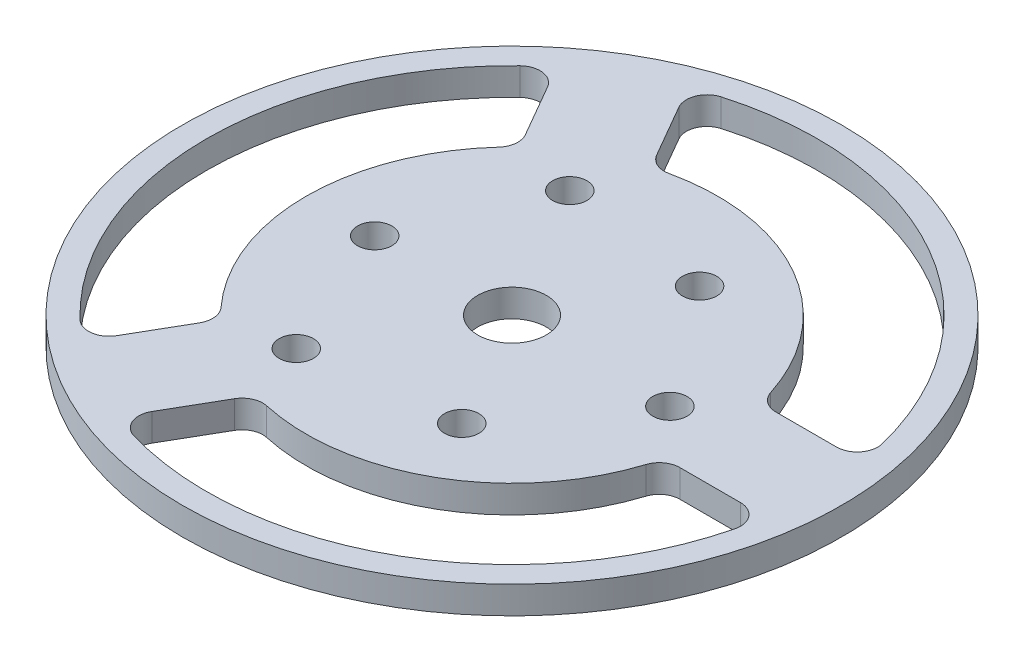
ISO-10303-21;
HEADER;
FILE_DESCRIPTION(('STEP AP214'),'2;1');
FILE_NAME('part.step','',(''),(''),'','','');
FILE_SCHEMA(('AUTOMOTIVE_DESIGN { 1 0 10303 214 1 1 1 1 }'));
ENDSEC;
DATA;
#1=APPLICATION_CONTEXT('core data for automotive mechanical design processes');
#2=APPLICATION_PROTOCOL_DEFINITION('international standard','automotive_design',2000,#1);
#3=PRODUCT_CONTEXT('',#1,'mechanical');
#4=PRODUCT('Part','Part','',(#3));
#5=PRODUCT_RELATED_PRODUCT_CATEGORY('part','',(#4));
#6=PRODUCT_DEFINITION_FORMATION('','',#4);
#7=PRODUCT_DEFINITION_CONTEXT('part definition',#1,'design');
#8=PRODUCT_DEFINITION('design','',#6,#7);
#9=PRODUCT_DEFINITION_SHAPE('','',#8);
#10=(LENGTH_UNIT() NAMED_UNIT(*) SI_UNIT(.MILLI.,.METRE.));
#11=(NAMED_UNIT(*) PLANE_ANGLE_UNIT() SI_UNIT($,.RADIAN.));
#12=(NAMED_UNIT(*) SI_UNIT($,.STERADIAN.) SOLID_ANGLE_UNIT());
#13=UNCERTAINTY_MEASURE_WITH_UNIT(LENGTH_MEASURE(1.E-05),#10,'distance_accuracy_value','');
#14=(GEOMETRIC_REPRESENTATION_CONTEXT(3) GLOBAL_UNCERTAINTY_ASSIGNED_CONTEXT((#13)) GLOBAL_UNIT_ASSIGNED_CONTEXT((#10,
#11,#12)) REPRESENTATION_CONTEXT('',''));
#15=CARTESIAN_POINT('',(0.,0.,0.));
#16=DIRECTION('',(0.,0.,1.));
#17=DIRECTION('',(1.,0.,0.));
#18=AXIS2_PLACEMENT_3D('',#15,#16,#17);
#19=CARTESIAN_POINT('',(0.,3.,0.));
#20=DIRECTION('',(0.,1.,0.));
#21=DIRECTION('',(0.,0.,1.));
#22=AXIS2_PLACEMENT_3D('',#19,#20,#21);
#23=PLANE('',#22);
#24=CARTESIAN_POINT('',(0.,3.,0.));
#25=DIRECTION('',(0.,1.,0.));
#26=DIRECTION('',(0.,0.,1.));
#27=AXIS2_PLACEMENT_3D('',#24,#25,#26);
#28=CIRCLE('',#27,5.);
#29=CARTESIAN_POINT('',(0.,3.,5.00000000000001));
#30=VERTEX_POINT('',#29);
#31=EDGE_CURVE('E365',#30,#30,#28,.T.);
#32=ORIENTED_EDGE('',*,*,#31,.F.);
#33=EDGE_LOOP('',(#32));
#34=FACE_BOUND('',#33,.T.);
#35=CARTESIAN_POINT('',(0.,3.,0.));
#36=DIRECTION('',(0.,1.,0.));
#37=DIRECTION('',(0.,0.,1.));
#38=AXIS2_PLACEMENT_3D('',#35,#36,#37);
#39=CIRCLE('',#38,44.5);
#40=CARTESIAN_POINT('',(43.188767017109,3.,-10.722891566265));
#41=VERTEX_POINT('',#40);
#42=CARTESIAN_POINT('',(-12.3080870101431,3.,-42.7640151780764));
#43=VERTEX_POINT('',#42);
#44=EDGE_CURVE('E390',#41,#43,#39,.T.);
#45=ORIENTED_EDGE('',*,*,#44,.F.);
#46=CARTESIAN_POINT('',(40.2771647462926,3.,-9.99999999999999));
#47=DIRECTION('',(0.,1.,0.));
#48=DIRECTION('',(0.,0.,1.));
#49=AXIS2_PLACEMENT_3D('',#46,#47,#48);
#50=CIRCLE('',#49,3.);
#51=CARTESIAN_POINT('',(40.2771647462926,3.,-6.99999999999999));
#52=VERTEX_POINT('',#51);
#53=EDGE_CURVE('E306',#41,#52,#50,.F.);
#54=ORIENTED_EDGE('',*,*,#53,.T.);
#55=DIRECTION('',(1.,0.,0.));
#56=VECTOR('',#55,1.);
#57=CARTESIAN_POINT('',(43.9459895781173,3.,-6.99999999999999));
#58=LINE('',#57,#56);
#59=CARTESIAN_POINT('',(31.4483703870327,3.,-6.99999999999999));
#60=VERTEX_POINT('',#59);
#61=EDGE_CURVE('E382',#60,#52,#58,.T.);
#62=ORIENTED_EDGE('',*,*,#61,.F.);
#63=CARTESIAN_POINT('',(31.4483703870327,3.,-9.99999999999999));
#64=DIRECTION('',(0.,1.,0.));
#65=DIRECTION('',(0.,0.,1.));
#66=AXIS2_PLACEMENT_3D('',#63,#64,#65);
#67=CIRCLE('',#66,3.);
#68=CARTESIAN_POINT('',(28.5894276245752,3.,-9.09090909090908));
#69=VERTEX_POINT('',#68);
#70=EDGE_CURVE('E318',#60,#69,#67,.F.);
#71=ORIENTED_EDGE('',*,*,#70,.T.);
#72=CARTESIAN_POINT('',(0.,3.,0.));
#73=DIRECTION('',(0.,-1.,0.));
#74=DIRECTION('',(0.,0.,1.));
#75=AXIS2_PLACEMENT_3D('',#72,#73,#74);
#76=CIRCLE('',#75,30.);
#77=CARTESIAN_POINT('',(-6.42175559606551,3.,-29.3046251479933));
#78=VERTEX_POINT('',#77);
#79=EDGE_CURVE('E396',#78,#69,#76,.T.);
#80=ORIENTED_EDGE('',*,*,#79,.F.);
#81=CARTESIAN_POINT('',(-7.06393115567206,3.,-32.2350876627926));
#82=DIRECTION('',(0.,1.,0.));
#83=DIRECTION('',(0.,0.,1.));
#84=AXIS2_PLACEMENT_3D('',#81,#82,#83);
#85=CIRCLE('',#84,3.);
#86=CARTESIAN_POINT('',(-9.66200736702538,3.,-30.7350876627926));
#87=VERTEX_POINT('',#86);
#88=EDGE_CURVE('E314',#78,#87,#85,.F.);
#89=ORIENTED_EDGE('',*,*,#88,.T.);
#90=DIRECTION('',(0.5,0.,0.866025403784438));
#91=VECTOR('',#90,1.);
#92=CARTESIAN_POINT('',(-15.9108169625677,3.,-41.5583433690958));
#93=LINE('',#92,#91);
#94=CARTESIAN_POINT('',(-14.0764045466553,3.,-38.3810478627004));
#95=VERTEX_POINT('',#94);
#96=EDGE_CURVE('E393',#95,#87,#93,.T.);
#97=ORIENTED_EDGE('',*,*,#96,.F.);
#98=CARTESIAN_POINT('',(-11.478328335302,3.,-39.8810478627004));
#99=DIRECTION('',(0.,1.,0.));
#100=DIRECTION('',(0.,0.,1.));
#101=AXIS2_PLACEMENT_3D('',#98,#99,#100);
#102=CIRCLE('',#101,3.);
#103=EDGE_CURVE('E298',#95,#43,#102,.F.);
#104=ORIENTED_EDGE('',*,*,#103,.T.);
#105=EDGE_LOOP('',(#45,#54,#62,#71,#80,#89,#97,#104));
#106=FACE_BOUND('',#105,.T.);
#107=CARTESIAN_POINT('',(0.,3.,0.));
#108=DIRECTION('',(0.,1.,0.));
#109=DIRECTION('',(0.,0.,1.));
#110=AXIS2_PLACEMENT_3D('',#107,#108,#109);
#111=CIRCLE('',#110,44.5);
#112=CARTESIAN_POINT('',(-30.880680006966,3.,-32.0411236118113));
#113=VERTEX_POINT('',#112);
#114=CARTESIAN_POINT('',(-30.880680006966,3.,32.0411236118114));
#115=VERTEX_POINT('',#114);
#116=EDGE_CURVE('E341',#113,#115,#111,.T.);
#117=ORIENTED_EDGE('',*,*,#116,.F.);
#118=CARTESIAN_POINT('',(-28.7988364109908,3.,-29.8810478627005));
#119=DIRECTION('',(0.,1.,0.));
#120=DIRECTION('',(0.,0.,1.));
#121=AXIS2_PLACEMENT_3D('',#118,#119,#120);
#122=CIRCLE('',#121,3.);
#123=CARTESIAN_POINT('',(-26.2007601996374,3.,-31.3810478627004));
#124=VERTEX_POINT('',#123);
#125=EDGE_CURVE('E48',#113,#124,#122,.F.);
#126=ORIENTED_EDGE('',*,*,#125,.T.);
#127=DIRECTION('',(-0.499999999999998,0.,-0.86602540378444));
#128=VECTOR('',#127,1.);
#129=CARTESIAN_POINT('',(-28.0351726155498,3.,-34.5583433690958));
#130=LINE('',#129,#128);
#131=CARTESIAN_POINT('',(-21.7863630200075,3.,-23.7350876627926));
#132=VERTEX_POINT('',#131);
#133=EDGE_CURVE('E339',#132,#124,#130,.T.);
#134=ORIENTED_EDGE('',*,*,#133,.F.);
#135=CARTESIAN_POINT('',(-24.3844392313608,3.,-22.2350876627926));
#136=DIRECTION('',(0.,1.,0.));
#137=DIRECTION('',(0.,0.,1.));
#138=AXIS2_PLACEMENT_3D('',#135,#136,#137);
#139=CIRCLE('',#138,3.);
#140=CARTESIAN_POINT('',(-22.1676720285098,3.,-20.2137160570842));
#141=VERTEX_POINT('',#140);
#142=EDGE_CURVE('E333',#132,#141,#139,.F.);
#143=ORIENTED_EDGE('',*,*,#142,.T.);
#144=CARTESIAN_POINT('',(0.,3.,0.));
#145=DIRECTION('',(0.,-1.,0.));
#146=DIRECTION('',(0.,0.,1.));
#147=AXIS2_PLACEMENT_3D('',#144,#145,#146);
#148=CIRCLE('',#147,30.);
#149=CARTESIAN_POINT('',(-22.1676720285098,3.,20.2137160570842));
#150=VERTEX_POINT('',#149);
#151=EDGE_CURVE('E347',#150,#141,#148,.T.);
#152=ORIENTED_EDGE('',*,*,#151,.F.);
#153=CARTESIAN_POINT('',(-24.3844392313608,3.,22.2350876627927));
#154=DIRECTION('',(0.,1.,0.));
#155=DIRECTION('',(0.,0.,1.));
#156=AXIS2_PLACEMENT_3D('',#153,#154,#155);
#157=CIRCLE('',#156,3.);
#158=CARTESIAN_POINT('',(-21.7863630200075,3.,23.7350876627927));
#159=VERTEX_POINT('',#158);
#160=EDGE_CURVE('E329',#150,#159,#157,.F.);
#161=ORIENTED_EDGE('',*,*,#160,.T.);
#162=DIRECTION('',(0.499999999999999,0.,-0.866025403784439));
#163=VECTOR('',#162,1.);
#164=CARTESIAN_POINT('',(-28.0351726155498,3.,34.5583433690959));
#165=LINE('',#164,#163);
#166=CARTESIAN_POINT('',(-26.2007601996374,3.,31.3810478627005));
#167=VERTEX_POINT('',#166);
#168=EDGE_CURVE('E372',#167,#159,#165,.T.);
#169=ORIENTED_EDGE('',*,*,#168,.F.);
#170=CARTESIAN_POINT('',(-28.7988364109908,3.,29.8810478627005));
#171=DIRECTION('',(0.,1.,0.));
#172=DIRECTION('',(0.,0.,1.));
#173=AXIS2_PLACEMENT_3D('',#170,#171,#172);
#174=CIRCLE('',#173,3.);
#175=EDGE_CURVE('E310',#167,#115,#174,.F.);
#176=ORIENTED_EDGE('',*,*,#175,.T.);
#177=EDGE_LOOP('',(#117,#126,#134,#143,#152,#161,#169,#176));
#178=FACE_BOUND('',#177,.T.);
#179=CARTESIAN_POINT('',(0.,3.,0.));
#180=DIRECTION('',(0.,1.,0.));
#181=DIRECTION('',(0.,0.,1.));
#182=AXIS2_PLACEMENT_3D('',#179,#180,#181);
#183=CIRCLE('',#182,44.5);
#184=CARTESIAN_POINT('',(-12.3080870101431,3.,42.7640151780764));
#185=VERTEX_POINT('',#184);
#186=CARTESIAN_POINT('',(43.188767017109,3.,10.7228915662651));
#187=VERTEX_POINT('',#186);
#188=EDGE_CURVE('E370',#185,#187,#183,.T.);
#189=ORIENTED_EDGE('',*,*,#188,.F.);
#190=CARTESIAN_POINT('',(-11.478328335302,3.,39.8810478627005));
#191=DIRECTION('',(0.,1.,0.));
#192=DIRECTION('',(0.,0.,1.));
#193=AXIS2_PLACEMENT_3D('',#190,#191,#192);
#194=CIRCLE('',#193,3.);
#195=CARTESIAN_POINT('',(-14.0764045466553,3.,38.3810478627005));
#196=VERTEX_POINT('',#195);
#197=EDGE_CURVE('E228',#185,#196,#194,.F.);
#198=ORIENTED_EDGE('',*,*,#197,.T.);
#199=DIRECTION('',(-0.5,0.,0.866025403784439));
#200=VECTOR('',#199,1.);
#201=CARTESIAN_POINT('',(-15.9108169625676,3.,41.5583433690959));
#202=LINE('',#201,#200);
#203=CARTESIAN_POINT('',(-9.66200736702536,3.,30.7350876627927));
#204=VERTEX_POINT('',#203);
#205=EDGE_CURVE('E219',#204,#196,#202,.T.);
#206=ORIENTED_EDGE('',*,*,#205,.F.);
#207=CARTESIAN_POINT('',(-7.06393115567204,3.,32.2350876627927));
#208=DIRECTION('',(0.,1.,0.));
#209=DIRECTION('',(0.,0.,1.));
#210=AXIS2_PLACEMENT_3D('',#207,#208,#209);
#211=CIRCLE('',#210,3.);
#212=CARTESIAN_POINT('',(-6.42175559606549,3.,29.3046251479933));
#213=VERTEX_POINT('',#212);
#214=EDGE_CURVE('E202',#204,#213,#211,.F.);
#215=ORIENTED_EDGE('',*,*,#214,.T.);
#216=CARTESIAN_POINT('',(0.,3.,0.));
#217=DIRECTION('',(0.,-1.,0.));
#218=DIRECTION('',(0.,0.,1.));
#219=AXIS2_PLACEMENT_3D('',#216,#217,#218);
#220=CIRCLE('',#219,30.);
#221=CARTESIAN_POINT('',(28.5894276245752,3.,9.0909090909091));
#222=VERTEX_POINT('',#221);
#223=EDGE_CURVE('E230',#222,#213,#220,.T.);
#224=ORIENTED_EDGE('',*,*,#223,.F.);
#225=CARTESIAN_POINT('',(31.4483703870327,3.,10.));
#226=DIRECTION('',(0.,1.,0.));
#227=DIRECTION('',(0.,0.,1.));
#228=AXIS2_PLACEMENT_3D('',#225,#226,#227);
#229=CIRCLE('',#228,3.);
#230=CARTESIAN_POINT('',(31.4483703870327,3.,7.00000000000001));
#231=VERTEX_POINT('',#230);
#232=EDGE_CURVE('E302',#222,#231,#229,.F.);
#233=ORIENTED_EDGE('',*,*,#232,.T.);
#234=DIRECTION('',(-1.,0.,0.));
#235=VECTOR('',#234,1.);
#236=CARTESIAN_POINT('',(43.9459895781173,3.,7.00000000000001));
#237=LINE('',#236,#235);
#238=CARTESIAN_POINT('',(40.2771647462926,3.,7.00000000000001));
#239=VERTEX_POINT('',#238);
#240=EDGE_CURVE('E235',#239,#231,#237,.T.);
#241=ORIENTED_EDGE('',*,*,#240,.F.);
#242=CARTESIAN_POINT('',(40.2771647462926,3.,10.));
#243=DIRECTION('',(0.,1.,0.));
#244=DIRECTION('',(0.,0.,1.));
#245=AXIS2_PLACEMENT_3D('',#242,#243,#244);
#246=CIRCLE('',#245,3.);
#247=EDGE_CURVE('E325',#239,#187,#246,.F.);
#248=ORIENTED_EDGE('',*,*,#247,.T.);
#249=EDGE_LOOP('',(#189,#198,#206,#215,#224,#233,#241,#248));
#250=FACE_BOUND('',#249,.T.);
#251=CARTESIAN_POINT('',(0.,3.,0.));
#252=DIRECTION('',(0.,1.,0.));
#253=DIRECTION('',(0.,0.,1.));
#254=AXIS2_PLACEMENT_3D('',#251,#252,#253);
#255=CIRCLE('',#254,48.);
#256=CARTESIAN_POINT('',(0.,3.,48.));
#257=VERTEX_POINT('',#256);
#258=EDGE_CURVE('E239',#257,#257,#255,.T.);
#259=ORIENTED_EDGE('',*,*,#258,.T.);
#260=EDGE_LOOP('',(#259));
#261=FACE_BOUND('',#260,.T.);
#262=CARTESIAN_POINT('',(9.99999999999995,3.,-17.3205080756888));
#263=DIRECTION('',(0.,1.,0.));
#264=DIRECTION('',(0.,0.,1.));
#265=AXIS2_PLACEMENT_3D('',#262,#263,#264);
#266=CIRCLE('',#265,2.5);
#267=CARTESIAN_POINT('',(9.99999999999995,3.,-14.8205080756888));
#268=VERTEX_POINT('',#267);
#269=EDGE_CURVE('E851',#268,#268,#266,.T.);
#270=ORIENTED_EDGE('',*,*,#269,.F.);
#271=EDGE_LOOP('',(#270));
#272=FACE_BOUND('',#271,.T.);
#273=CARTESIAN_POINT('',(10.000000000003,3.,17.3205080756887));
#274=DIRECTION('',(0.,1.,0.));
#275=DIRECTION('',(0.,0.,1.));
#276=AXIS2_PLACEMENT_3D('',#273,#274,#275);
#277=CIRCLE('',#276,2.50000000000074);
#278=CARTESIAN_POINT('',(10.000000000003,3.,19.8205080756895));
#279=VERTEX_POINT('',#278);
#280=EDGE_CURVE('E845',#279,#279,#277,.T.);
#281=ORIENTED_EDGE('',*,*,#280,.F.);
#282=EDGE_LOOP('',(#281));
#283=FACE_BOUND('',#282,.T.);
#284=CARTESIAN_POINT('',(-19.9999999999985,3.,2.60784058521334E-12));
#285=DIRECTION('',(0.,1.,0.));
#286=DIRECTION('',(0.,0.,1.));
#287=AXIS2_PLACEMENT_3D('',#284,#285,#286);
#288=CIRCLE('',#287,2.50000000000296);
#289=CARTESIAN_POINT('',(-19.9999999999985,3.,2.50000000000557));
#290=VERTEX_POINT('',#289);
#291=EDGE_CURVE('E839',#290,#290,#288,.T.);
#292=ORIENTED_EDGE('',*,*,#291,.F.);
#293=EDGE_LOOP('',(#292));
#294=FACE_BOUND('',#293,.T.);
#295=CARTESIAN_POINT('',(-11.4999999999999,3.,-19.9185842870422));
#296=DIRECTION('',(0.,1.,0.));
#297=DIRECTION('',(0.,0.,1.));
#298=AXIS2_PLACEMENT_3D('',#295,#296,#297);
#299=CIRCLE('',#298,2.5);
#300=CARTESIAN_POINT('',(-11.4999999999999,3.,-17.4185842870422));
#301=VERTEX_POINT('',#300);
#302=EDGE_CURVE('E833',#301,#301,#299,.T.);
#303=ORIENTED_EDGE('',*,*,#302,.F.);
#304=EDGE_LOOP('',(#303));
#305=FACE_BOUND('',#304,.T.);
#306=CARTESIAN_POINT('',(23.0000000000014,3.,-2.25828933374841E-12));
#307=DIRECTION('',(0.,1.,0.));
#308=DIRECTION('',(0.,0.,1.));
#309=AXIS2_PLACEMENT_3D('',#306,#307,#308);
#310=CIRCLE('',#309,2.50000000000279);
#311=CARTESIAN_POINT('',(23.0000000000014,3.,2.50000000000053));
#312=VERTEX_POINT('',#311);
#313=EDGE_CURVE('E825',#312,#312,#310,.T.);
#314=ORIENTED_EDGE('',*,*,#313,.F.);
#315=EDGE_LOOP('',(#314));
#316=FACE_BOUND('',#315,.T.);
#317=CARTESIAN_POINT('',(-11.4999999999973,3.,19.918584287042));
#318=DIRECTION('',(0.,1.,0.));
#319=DIRECTION('',(0.,0.,1.));
#320=AXIS2_PLACEMENT_3D('',#317,#318,#319);
#321=CIRCLE('',#320,2.50000000000227);
#322=CARTESIAN_POINT('',(-11.4999999999973,3.,22.4185842870443));
#323=VERTEX_POINT('',#322);
#324=EDGE_CURVE('E822',#323,#323,#321,.T.);
#325=ORIENTED_EDGE('',*,*,#324,.F.);
#326=EDGE_LOOP('',(#325));
#327=FACE_BOUND('',#326,.T.);
#328=ADVANCED_FACE('F39',(#34,#106,#178,#250,#261,#272,#283,#294,#305,#316,#327),#23,.T.);
#329=CARTESIAN_POINT('',(0.,-1.,0.));
#330=DIRECTION('',(0.,1.,0.));
#331=DIRECTION('',(0.,0.,1.));
#332=AXIS2_PLACEMENT_3D('',#329,#330,#331);
#333=PLANE('',#332);
#334=CARTESIAN_POINT('',(0.,-1.,0.));
#335=DIRECTION('',(0.,1.,0.));
#336=DIRECTION('',(0.,0.,1.));
#337=AXIS2_PLACEMENT_3D('',#334,#335,#336);
#338=CIRCLE('',#337,5.);
#339=CARTESIAN_POINT('',(0.,-1.,5.00000000000001));
#340=VERTEX_POINT('',#339);
#341=EDGE_CURVE('E43',#340,#340,#338,.T.);
#342=ORIENTED_EDGE('',*,*,#341,.T.);
#343=EDGE_LOOP('',(#342));
#344=FACE_BOUND('',#343,.T.);
#345=CARTESIAN_POINT('',(0.,-1.,0.));
#346=DIRECTION('',(0.,-1.,0.));
#347=DIRECTION('',(0.,0.,1.));
#348=AXIS2_PLACEMENT_3D('',#345,#346,#347);
#349=CIRCLE('',#348,30.);
#350=CARTESIAN_POINT('',(-6.42175559606551,-1.,-29.3046251479933));
#351=VERTEX_POINT('',#350);
#352=CARTESIAN_POINT('',(28.5894276245752,-1.,-9.09090909090908));
#353=VERTEX_POINT('',#352);
#354=EDGE_CURVE('E385',#351,#353,#349,.T.);
#355=ORIENTED_EDGE('',*,*,#354,.T.);
#356=CARTESIAN_POINT('',(31.4483703870327,-1.,-9.99999999999999));
#357=DIRECTION('',(0.,1.,0.));
#358=DIRECTION('',(0.,0.,1.));
#359=AXIS2_PLACEMENT_3D('',#356,#357,#358);
#360=CIRCLE('',#359,3.);
#361=CARTESIAN_POINT('',(31.4483703870327,-1.,-6.99999999999999));
#362=VERTEX_POINT('',#361);
#363=EDGE_CURVE('E320',#353,#362,#360,.T.);
#364=ORIENTED_EDGE('',*,*,#363,.T.);
#365=DIRECTION('',(1.,0.,0.));
#366=VECTOR('',#365,1.);
#367=CARTESIAN_POINT('',(43.9459895781173,-1.,-6.99999999999999));
#368=LINE('',#367,#366);
#369=CARTESIAN_POINT('',(40.2771647462926,-1.,-6.99999999999999));
#370=VERTEX_POINT('',#369);
#371=EDGE_CURVE('E373',#362,#370,#368,.T.);
#372=ORIENTED_EDGE('',*,*,#371,.T.);
#373=CARTESIAN_POINT('',(40.2771647462926,-1.,-9.99999999999999));
#374=DIRECTION('',(0.,1.,0.));
#375=DIRECTION('',(0.,0.,1.));
#376=AXIS2_PLACEMENT_3D('',#373,#374,#375);
#377=CIRCLE('',#376,3.);
#378=CARTESIAN_POINT('',(43.188767017109,-1.,-10.722891566265));
#379=VERTEX_POINT('',#378);
#380=EDGE_CURVE('E308',#370,#379,#377,.T.);
#381=ORIENTED_EDGE('',*,*,#380,.T.);
#382=CARTESIAN_POINT('',(0.,-1.,0.));
#383=DIRECTION('',(0.,1.,0.));
#384=DIRECTION('',(0.,0.,1.));
#385=AXIS2_PLACEMENT_3D('',#382,#383,#384);
#386=CIRCLE('',#385,44.5);
#387=CARTESIAN_POINT('',(-12.3080870101431,-1.,-42.7640151780764));
#388=VERTEX_POINT('',#387);
#389=EDGE_CURVE('E378',#379,#388,#386,.T.);
#390=ORIENTED_EDGE('',*,*,#389,.T.);
#391=CARTESIAN_POINT('',(-11.478328335302,-1.,-39.8810478627004));
#392=DIRECTION('',(0.,1.,0.));
#393=DIRECTION('',(0.,0.,1.));
#394=AXIS2_PLACEMENT_3D('',#391,#392,#393);
#395=CIRCLE('',#394,3.);
#396=CARTESIAN_POINT('',(-14.0764045466553,-1.,-38.3810478627004));
#397=VERTEX_POINT('',#396);
#398=EDGE_CURVE('E300',#388,#397,#395,.T.);
#399=ORIENTED_EDGE('',*,*,#398,.T.);
#400=DIRECTION('',(0.5,0.,0.866025403784438));
#401=VECTOR('',#400,1.);
#402=CARTESIAN_POINT('',(-15.9108169625677,-1.,-41.5583433690958));
#403=LINE('',#402,#401);
#404=CARTESIAN_POINT('',(-9.66200736702538,-1.,-30.7350876627926));
#405=VERTEX_POINT('',#404);
#406=EDGE_CURVE('E381',#397,#405,#403,.T.);
#407=ORIENTED_EDGE('',*,*,#406,.T.);
#408=CARTESIAN_POINT('',(-7.06393115567206,-1.,-32.2350876627926));
#409=DIRECTION('',(0.,1.,0.));
#410=DIRECTION('',(0.,0.,1.));
#411=AXIS2_PLACEMENT_3D('',#408,#409,#410);
#412=CIRCLE('',#411,3.);
#413=EDGE_CURVE('E316',#405,#351,#412,.T.);
#414=ORIENTED_EDGE('',*,*,#413,.T.);
#415=EDGE_LOOP('',(#355,#364,#372,#381,#390,#399,#407,#414));
#416=FACE_BOUND('',#415,.T.);
#417=CARTESIAN_POINT('',(0.,-1.,0.));
#418=DIRECTION('',(0.,-1.,0.));
#419=DIRECTION('',(0.,0.,1.));
#420=AXIS2_PLACEMENT_3D('',#417,#418,#419);
#421=CIRCLE('',#420,30.);
#422=CARTESIAN_POINT('',(-22.1676720285098,-1.,20.2137160570842));
#423=VERTEX_POINT('',#422);
#424=CARTESIAN_POINT('',(-22.1676720285098,-1.,-20.2137160570842));
#425=VERTEX_POINT('',#424);
#426=EDGE_CURVE('E362',#423,#425,#421,.T.);
#427=ORIENTED_EDGE('',*,*,#426,.T.);
#428=CARTESIAN_POINT('',(-24.3844392313608,-1.,-22.2350876627926));
#429=DIRECTION('',(0.,1.,0.));
#430=DIRECTION('',(0.,0.,1.));
#431=AXIS2_PLACEMENT_3D('',#428,#429,#430);
#432=CIRCLE('',#431,3.);
#433=CARTESIAN_POINT('',(-21.7863630200075,-1.,-23.7350876627926));
#434=VERTEX_POINT('',#433);
#435=EDGE_CURVE('E62',#425,#434,#432,.T.);
#436=ORIENTED_EDGE('',*,*,#435,.T.);
#437=DIRECTION('',(-0.499999999999998,0.,-0.86602540378444));
#438=VECTOR('',#437,1.);
#439=CARTESIAN_POINT('',(-28.0351726155498,-1.,-34.5583433690958));
#440=LINE('',#439,#438);
#441=CARTESIAN_POINT('',(-26.2007601996374,-1.,-31.3810478627004));
#442=VERTEX_POINT('',#441);
#443=EDGE_CURVE('E355',#434,#442,#440,.T.);
#444=ORIENTED_EDGE('',*,*,#443,.T.);
#445=CARTESIAN_POINT('',(-28.7988364109908,-1.,-29.8810478627005));
#446=DIRECTION('',(0.,1.,0.));
#447=DIRECTION('',(0.,0.,1.));
#448=AXIS2_PLACEMENT_3D('',#445,#446,#447);
#449=CIRCLE('',#448,3.);
#450=CARTESIAN_POINT('',(-30.880680006966,-1.,-32.0411236118113));
#451=VERTEX_POINT('',#450);
#452=EDGE_CURVE('E11',#442,#451,#449,.T.);
#453=ORIENTED_EDGE('',*,*,#452,.T.);
#454=CARTESIAN_POINT('',(0.,-1.,0.));
#455=DIRECTION('',(0.,1.,0.));
#456=DIRECTION('',(0.,0.,1.));
#457=AXIS2_PLACEMENT_3D('',#454,#455,#456);
#458=CIRCLE('',#457,44.5);
#459=CARTESIAN_POINT('',(-30.880680006966,-1.,32.0411236118114));
#460=VERTEX_POINT('',#459);
#461=EDGE_CURVE('E346',#451,#460,#458,.T.);
#462=ORIENTED_EDGE('',*,*,#461,.T.);
#463=CARTESIAN_POINT('',(-28.7988364109908,-1.,29.8810478627005));
#464=DIRECTION('',(0.,1.,0.));
#465=DIRECTION('',(0.,0.,1.));
#466=AXIS2_PLACEMENT_3D('',#463,#464,#465);
#467=CIRCLE('',#466,3.);
#468=CARTESIAN_POINT('',(-26.2007601996374,-1.,31.3810478627005));
#469=VERTEX_POINT('',#468);
#470=EDGE_CURVE('E312',#460,#469,#467,.T.);
#471=ORIENTED_EDGE('',*,*,#470,.T.);
#472=DIRECTION('',(0.499999999999999,0.,-0.866025403784439));
#473=VECTOR('',#472,1.);
#474=CARTESIAN_POINT('',(-28.0351726155498,-1.,34.5583433690959));
#475=LINE('',#474,#473);
#476=CARTESIAN_POINT('',(-21.7863630200075,-1.,23.7350876627927));
#477=VERTEX_POINT('',#476);
#478=EDGE_CURVE('E359',#469,#477,#475,.T.);
#479=ORIENTED_EDGE('',*,*,#478,.T.);
#480=CARTESIAN_POINT('',(-24.3844392313608,-1.,22.2350876627927));
#481=DIRECTION('',(0.,1.,0.));
#482=DIRECTION('',(0.,0.,1.));
#483=AXIS2_PLACEMENT_3D('',#480,#481,#482);
#484=CIRCLE('',#483,3.);
#485=EDGE_CURVE('E331',#477,#423,#484,.T.);
#486=ORIENTED_EDGE('',*,*,#485,.T.);
#487=EDGE_LOOP('',(#427,#436,#444,#453,#462,#471,#479,#486));
#488=FACE_BOUND('',#487,.T.);
#489=CARTESIAN_POINT('',(0.,-1.,0.));
#490=DIRECTION('',(0.,-1.,0.));
#491=DIRECTION('',(0.,0.,1.));
#492=AXIS2_PLACEMENT_3D('',#489,#490,#491);
#493=CIRCLE('',#492,30.);
#494=CARTESIAN_POINT('',(28.5894276245752,-1.,9.0909090909091));
#495=VERTEX_POINT('',#494);
#496=CARTESIAN_POINT('',(-6.42175559606549,-1.,29.3046251479933));
#497=VERTEX_POINT('',#496);
#498=EDGE_CURVE('E403',#495,#497,#493,.T.);
#499=ORIENTED_EDGE('',*,*,#498,.T.);
#500=CARTESIAN_POINT('',(-7.06393115567204,-1.,32.2350876627927));
#501=DIRECTION('',(0.,1.,0.));
#502=DIRECTION('',(0.,0.,1.));
#503=AXIS2_PLACEMENT_3D('',#500,#501,#502);
#504=CIRCLE('',#503,3.);
#505=CARTESIAN_POINT('',(-9.66200736702536,-1.,30.7350876627927));
#506=VERTEX_POINT('',#505);
#507=EDGE_CURVE('E212',#497,#506,#504,.T.);
#508=ORIENTED_EDGE('',*,*,#507,.T.);
#509=DIRECTION('',(-0.5,0.,0.866025403784439));
#510=VECTOR('',#509,1.);
#511=CARTESIAN_POINT('',(-15.9108169625676,-1.,41.5583433690959));
#512=LINE('',#511,#510);
#513=CARTESIAN_POINT('',(-14.0764045466553,-1.,38.3810478627005));
#514=VERTEX_POINT('',#513);
#515=EDGE_CURVE('E222',#506,#514,#512,.T.);
#516=ORIENTED_EDGE('',*,*,#515,.T.);
#517=CARTESIAN_POINT('',(-11.478328335302,-1.,39.8810478627005));
#518=DIRECTION('',(0.,1.,0.));
#519=DIRECTION('',(0.,0.,1.));
#520=AXIS2_PLACEMENT_3D('',#517,#518,#519);
#521=CIRCLE('',#520,3.);
#522=CARTESIAN_POINT('',(-12.3080870101431,-1.,42.7640151780764));
#523=VERTEX_POINT('',#522);
#524=EDGE_CURVE('E323',#514,#523,#521,.T.);
#525=ORIENTED_EDGE('',*,*,#524,.T.);
#526=CARTESIAN_POINT('',(0.,-1.,0.));
#527=DIRECTION('',(0.,1.,0.));
#528=DIRECTION('',(0.,0.,1.));
#529=AXIS2_PLACEMENT_3D('',#526,#527,#528);
#530=CIRCLE('',#529,44.5);
#531=CARTESIAN_POINT('',(43.188767017109,-1.,10.7228915662651));
#532=VERTEX_POINT('',#531);
#533=EDGE_CURVE('E229',#523,#532,#530,.T.);
#534=ORIENTED_EDGE('',*,*,#533,.T.);
#535=CARTESIAN_POINT('',(40.2771647462926,-1.,10.));
#536=DIRECTION('',(0.,1.,0.));
#537=DIRECTION('',(0.,0.,1.));
#538=AXIS2_PLACEMENT_3D('',#535,#536,#537);
#539=CIRCLE('',#538,3.);
#540=CARTESIAN_POINT('',(40.2771647462926,-1.,7.00000000000001));
#541=VERTEX_POINT('',#540);
#542=EDGE_CURVE('E327',#532,#541,#539,.T.);
#543=ORIENTED_EDGE('',*,*,#542,.T.);
#544=DIRECTION('',(-1.,0.,0.));
#545=VECTOR('',#544,1.);
#546=CARTESIAN_POINT('',(43.9459895781173,-1.,7.00000000000001));
#547=LINE('',#546,#545);
#548=CARTESIAN_POINT('',(31.4483703870327,-1.,7.00000000000001));
#549=VERTEX_POINT('',#548);
#550=EDGE_CURVE('E233',#541,#549,#547,.T.);
#551=ORIENTED_EDGE('',*,*,#550,.T.);
#552=CARTESIAN_POINT('',(31.4483703870327,-1.,10.));
#553=DIRECTION('',(0.,1.,0.));
#554=DIRECTION('',(0.,0.,1.));
#555=AXIS2_PLACEMENT_3D('',#552,#553,#554);
#556=CIRCLE('',#555,3.);
#557=EDGE_CURVE('E304',#549,#495,#556,.T.);
#558=ORIENTED_EDGE('',*,*,#557,.T.);
#559=EDGE_LOOP('',(#499,#508,#516,#525,#534,#543,#551,#558));
#560=FACE_BOUND('',#559,.T.);
#561=CARTESIAN_POINT('',(0.,-1.,0.));
#562=DIRECTION('',(0.,1.,0.));
#563=DIRECTION('',(0.,0.,1.));
#564=AXIS2_PLACEMENT_3D('',#561,#562,#563);
#565=CIRCLE('',#564,48.);
#566=CARTESIAN_POINT('',(0.,-1.,48.));
#567=VERTEX_POINT('',#566);
#568=EDGE_CURVE('E242',#567,#567,#565,.T.);
#569=ORIENTED_EDGE('',*,*,#568,.F.);
#570=EDGE_LOOP('',(#569));
#571=FACE_BOUND('',#570,.T.);
#572=CARTESIAN_POINT('',(9.99999999999995,-1.,-17.3205080756888));
#573=DIRECTION('',(0.,1.,0.));
#574=DIRECTION('',(0.,0.,1.));
#575=AXIS2_PLACEMENT_3D('',#572,#573,#574);
#576=CIRCLE('',#575,2.5);
#577=CARTESIAN_POINT('',(9.99999999999995,-1.,-14.8205080756888));
#578=VERTEX_POINT('',#577);
#579=EDGE_CURVE('E853',#578,#578,#576,.F.);
#580=ORIENTED_EDGE('',*,*,#579,.F.);
#581=EDGE_LOOP('',(#580));
#582=FACE_BOUND('',#581,.T.);
#583=CARTESIAN_POINT('',(10.000000000003,-1.,17.3205080756887));
#584=DIRECTION('',(0.,1.,0.));
#585=DIRECTION('',(0.,0.,1.));
#586=AXIS2_PLACEMENT_3D('',#583,#584,#585);
#587=CIRCLE('',#586,2.50000000000074);
#588=CARTESIAN_POINT('',(10.000000000003,-1.,19.8205080756895));
#589=VERTEX_POINT('',#588);
#590=EDGE_CURVE('E848',#589,#589,#587,.F.);
#591=ORIENTED_EDGE('',*,*,#590,.F.);
#592=EDGE_LOOP('',(#591));
#593=FACE_BOUND('',#592,.T.);
#594=CARTESIAN_POINT('',(-19.9999999999985,-1.,2.60784058521334E-12));
#595=DIRECTION('',(0.,1.,0.));
#596=DIRECTION('',(0.,0.,1.));
#597=AXIS2_PLACEMENT_3D('',#594,#595,#596);
#598=CIRCLE('',#597,2.50000000000296);
#599=CARTESIAN_POINT('',(-19.9999999999985,-1.,2.50000000000557));
#600=VERTEX_POINT('',#599);
#601=EDGE_CURVE('E842',#600,#600,#598,.F.);
#602=ORIENTED_EDGE('',*,*,#601,.F.);
#603=EDGE_LOOP('',(#602));
#604=FACE_BOUND('',#603,.T.);
#605=CARTESIAN_POINT('',(-11.4999999999999,-1.,-19.9185842870422));
#606=DIRECTION('',(0.,1.,0.));
#607=DIRECTION('',(0.,0.,1.));
#608=AXIS2_PLACEMENT_3D('',#605,#606,#607);
#609=CIRCLE('',#608,2.5);
#610=CARTESIAN_POINT('',(-11.4999999999999,-1.,-17.4185842870422));
#611=VERTEX_POINT('',#610);
#612=EDGE_CURVE('E836',#611,#611,#609,.F.);
#613=ORIENTED_EDGE('',*,*,#612,.F.);
#614=EDGE_LOOP('',(#613));
#615=FACE_BOUND('',#614,.T.);
#616=CARTESIAN_POINT('',(23.0000000000014,-1.,-2.25828933374841E-12));
#617=DIRECTION('',(0.,1.,0.));
#618=DIRECTION('',(0.,0.,1.));
#619=AXIS2_PLACEMENT_3D('',#616,#617,#618);
#620=CIRCLE('',#619,2.50000000000279);
#621=CARTESIAN_POINT('',(23.0000000000014,-1.,2.50000000000053));
#622=VERTEX_POINT('',#621);
#623=EDGE_CURVE('E830',#622,#622,#620,.F.);
#624=ORIENTED_EDGE('',*,*,#623,.F.);
#625=EDGE_LOOP('',(#624));
#626=FACE_BOUND('',#625,.T.);
#627=CARTESIAN_POINT('',(-11.4999999999973,-1.,19.918584287042));
#628=DIRECTION('',(0.,1.,0.));
#629=DIRECTION('',(0.,0.,1.));
#630=AXIS2_PLACEMENT_3D('',#627,#628,#629);
#631=CIRCLE('',#630,2.50000000000227);
#632=CARTESIAN_POINT('',(-11.4999999999973,-1.,22.4185842870443));
#633=VERTEX_POINT('',#632);
#634=EDGE_CURVE('E819',#633,#633,#631,.F.);
#635=ORIENTED_EDGE('',*,*,#634,.F.);
#636=EDGE_LOOP('',(#635));
#637=FACE_BOUND('',#636,.T.);
#638=ADVANCED_FACE('F352',(#344,#416,#488,#560,#571,#582,#593,#604,#615,#626,#637),#333,.F.);
#639=CARTESIAN_POINT('',(0.,3.,0.));
#640=DIRECTION('',(0.,-1.,0.));
#641=DIRECTION('',(0.,0.,-1.));
#642=AXIS2_PLACEMENT_3D('',#639,#640,#641);
#643=CYLINDRICAL_SURFACE('',#642,48.);
#644=ORIENTED_EDGE('',*,*,#258,.F.);
#645=EDGE_LOOP('',(#644));
#646=FACE_BOUND('',#645,.T.);
#647=ORIENTED_EDGE('',*,*,#568,.T.);
#648=EDGE_LOOP('',(#647));
#649=FACE_BOUND('',#648,.T.);
#650=ADVANCED_FACE('F439',(#646,#649),#643,.T.);
#651=CARTESIAN_POINT('',(0.,-1.,0.));
#652=DIRECTION('',(0.,1.,0.));
#653=DIRECTION('',(0.,0.,1.));
#654=AXIS2_PLACEMENT_3D('',#651,#652,#653);
#655=CYLINDRICAL_SURFACE('',#654,44.5);
#656=ORIENTED_EDGE('',*,*,#533,.F.);
#657=DIRECTION('',(0.,1.,0.));
#658=VECTOR('',#657,1.);
#659=CARTESIAN_POINT('',(-12.3080870101431,-1.,42.7640151780764));
#660=LINE('',#659,#658);
#661=EDGE_CURVE('E286',#523,#185,#660,.T.);
#662=ORIENTED_EDGE('',*,*,#661,.T.);
#663=ORIENTED_EDGE('',*,*,#188,.T.);
#664=DIRECTION('',(0.,1.,0.));
#665=VECTOR('',#664,1.);
#666=CARTESIAN_POINT('',(43.188767017109,-1.,10.7228915662651));
#667=LINE('',#666,#665);
#668=EDGE_CURVE('E284',#187,#532,#667,.F.);
#669=ORIENTED_EDGE('',*,*,#668,.T.);
#670=EDGE_LOOP('',(#656,#662,#663,#669));
#671=FACE_BOUND('',#670,.T.);
#672=ADVANCED_FACE('F430',(#671),#655,.F.);
#673=CARTESIAN_POINT('',(-15.9108169625676,-1.,41.5583433690959));
#674=DIRECTION('',(-0.866025403784439,0.,-0.5));
#675=DIRECTION('',(-0.5,0.,0.866025403784439));
#676=AXIS2_PLACEMENT_3D('',#673,#674,#675);
#677=PLANE('',#676);
#678=ORIENTED_EDGE('',*,*,#515,.F.);
#679=DIRECTION('',(0.,-1.,0.));
#680=VECTOR('',#679,1.);
#681=CARTESIAN_POINT('',(-9.66200736702536,3.,30.7350876627927));
#682=LINE('',#681,#680);
#683=EDGE_CURVE('E206',#506,#204,#682,.F.);
#684=ORIENTED_EDGE('',*,*,#683,.T.);
#685=ORIENTED_EDGE('',*,*,#205,.T.);
#686=DIRECTION('',(0.,-1.,0.));
#687=VECTOR('',#686,1.);
#688=CARTESIAN_POINT('',(-14.0764045466553,-1.,38.3810478627005));
#689=LINE('',#688,#687);
#690=EDGE_CURVE('E224',#196,#514,#689,.T.);
#691=ORIENTED_EDGE('',*,*,#690,.T.);
#692=EDGE_LOOP('',(#678,#684,#685,#691));
#693=FACE_BOUND('',#692,.T.);
#694=ADVANCED_FACE('F218',(#693),#677,.F.);
#695=CARTESIAN_POINT('',(0.,-1.,0.));
#696=DIRECTION('',(0.,1.,0.));
#697=DIRECTION('',(0.,0.,1.));
#698=AXIS2_PLACEMENT_3D('',#695,#696,#697);
#699=CYLINDRICAL_SURFACE('',#698,30.);
#700=ORIENTED_EDGE('',*,*,#223,.T.);
#701=DIRECTION('',(0.,1.,0.));
#702=VECTOR('',#701,1.);
#703=CARTESIAN_POINT('',(-6.42175559606549,-1.,29.3046251479933));
#704=LINE('',#703,#702);
#705=EDGE_CURVE('E207',#213,#497,#704,.F.);
#706=ORIENTED_EDGE('',*,*,#705,.T.);
#707=ORIENTED_EDGE('',*,*,#498,.F.);
#708=DIRECTION('',(0.,1.,0.));
#709=VECTOR('',#708,1.);
#710=CARTESIAN_POINT('',(28.5894276245752,-1.,9.0909090909091));
#711=LINE('',#710,#709);
#712=EDGE_CURVE('E223',#495,#222,#711,.T.);
#713=ORIENTED_EDGE('',*,*,#712,.T.);
#714=EDGE_LOOP('',(#700,#706,#707,#713));
#715=FACE_BOUND('',#714,.T.);
#716=ADVANCED_FACE('F422',(#715),#699,.T.);
#717=CARTESIAN_POINT('',(43.9459895781173,-1.,7.00000000000001));
#718=DIRECTION('',(0.,0.,-1.));
#719=DIRECTION('',(-1.,0.,0.));
#720=AXIS2_PLACEMENT_3D('',#717,#718,#719);
#721=PLANE('',#720);
#722=ORIENTED_EDGE('',*,*,#240,.T.);
#723=DIRECTION('',(0.,-1.,0.));
#724=VECTOR('',#723,1.);
#725=CARTESIAN_POINT('',(31.4483703870327,-1.,7.00000000000001));
#726=LINE('',#725,#724);
#727=EDGE_CURVE('E262',#231,#549,#726,.T.);
#728=ORIENTED_EDGE('',*,*,#727,.T.);
#729=ORIENTED_EDGE('',*,*,#550,.F.);
#730=DIRECTION('',(0.,-1.,0.));
#731=VECTOR('',#730,1.);
#732=CARTESIAN_POINT('',(40.2771647462926,3.,7.00000000000001));
#733=LINE('',#732,#731);
#734=EDGE_CURVE('E259',#541,#239,#733,.F.);
#735=ORIENTED_EDGE('',*,*,#734,.T.);
#736=EDGE_LOOP('',(#722,#728,#729,#735));
#737=FACE_BOUND('',#736,.T.);
#738=ADVANCED_FACE('F412',(#737),#721,.F.);
#739=CARTESIAN_POINT('',(0.,-1.,0.));
#740=DIRECTION('',(0.,1.,0.));
#741=DIRECTION('',(0.,0.,1.));
#742=AXIS2_PLACEMENT_3D('',#739,#740,#741);
#743=CYLINDRICAL_SURFACE('',#742,44.5);
#744=ORIENTED_EDGE('',*,*,#116,.T.);
#745=DIRECTION('',(0.,1.,0.));
#746=VECTOR('',#745,1.);
#747=CARTESIAN_POINT('',(-30.880680006966,-1.,32.0411236118114));
#748=LINE('',#747,#746);
#749=EDGE_CURVE('E277',#115,#460,#748,.F.);
#750=ORIENTED_EDGE('',*,*,#749,.T.);
#751=ORIENTED_EDGE('',*,*,#461,.F.);
#752=DIRECTION('',(0.,1.,0.));
#753=VECTOR('',#752,1.);
#754=CARTESIAN_POINT('',(-30.880680006966,-1.,-32.0411236118113));
#755=LINE('',#754,#753);
#756=EDGE_CURVE('E274',#451,#113,#755,.T.);
#757=ORIENTED_EDGE('',*,*,#756,.T.);
#758=EDGE_LOOP('',(#744,#750,#751,#757));
#759=FACE_BOUND('',#758,.T.);
#760=ADVANCED_FACE('F357',(#759),#743,.F.);
#761=CARTESIAN_POINT('',(-28.0351726155498,-1.,-34.5583433690958));
#762=DIRECTION('',(0.86602540378444,0.,-0.499999999999998));
#763=DIRECTION('',(-0.499999999999998,0.,-0.86602540378444));
#764=AXIS2_PLACEMENT_3D('',#761,#762,#763);
#765=PLANE('',#764);
#766=ORIENTED_EDGE('',*,*,#443,.F.);
#767=DIRECTION('',(0.,-1.,0.));
#768=VECTOR('',#767,1.);
#769=CARTESIAN_POINT('',(-21.7863630200075,3.,-23.7350876627926));
#770=LINE('',#769,#768);
#771=EDGE_CURVE('E213',#434,#132,#770,.F.);
#772=ORIENTED_EDGE('',*,*,#771,.T.);
#773=ORIENTED_EDGE('',*,*,#133,.T.);
#774=DIRECTION('',(0.,-1.,0.));
#775=VECTOR('',#774,1.);
#776=CARTESIAN_POINT('',(-26.2007601996374,-1.,-31.3810478627004));
#777=LINE('',#776,#775);
#778=EDGE_CURVE('E55',#124,#442,#777,.T.);
#779=ORIENTED_EDGE('',*,*,#778,.T.);
#780=EDGE_LOOP('',(#766,#772,#773,#779));
#781=FACE_BOUND('',#780,.T.);
#782=ADVANCED_FACE('F344',(#781),#765,.F.);
#783=CARTESIAN_POINT('',(0.,-1.,0.));
#784=DIRECTION('',(0.,1.,0.));
#785=DIRECTION('',(0.,0.,1.));
#786=AXIS2_PLACEMENT_3D('',#783,#784,#785);
#787=CYLINDRICAL_SURFACE('',#786,30.);
#788=ORIENTED_EDGE('',*,*,#426,.F.);
#789=DIRECTION('',(0.,1.,0.));
#790=VECTOR('',#789,1.);
#791=CARTESIAN_POINT('',(-22.1676720285098,-1.,20.2137160570842));
#792=LINE('',#791,#790);
#793=EDGE_CURVE('E291',#423,#150,#792,.T.);
#794=ORIENTED_EDGE('',*,*,#793,.T.);
#795=ORIENTED_EDGE('',*,*,#151,.T.);
#796=DIRECTION('',(0.,1.,0.));
#797=VECTOR('',#796,1.);
#798=CARTESIAN_POINT('',(-22.1676720285098,-1.,-20.2137160570842));
#799=LINE('',#798,#797);
#800=EDGE_CURVE('E289',#141,#425,#799,.F.);
#801=ORIENTED_EDGE('',*,*,#800,.T.);
#802=EDGE_LOOP('',(#788,#794,#795,#801));
#803=FACE_BOUND('',#802,.T.);
#804=ADVANCED_FACE('F496',(#803),#787,.T.);
#805=CARTESIAN_POINT('',(-28.0351726155498,-1.,34.5583433690959));
#806=DIRECTION('',(0.866025403784439,0.,0.5));
#807=DIRECTION('',(0.499999999999999,0.,-0.866025403784439));
#808=AXIS2_PLACEMENT_3D('',#805,#806,#807);
#809=PLANE('',#808);
#810=ORIENTED_EDGE('',*,*,#478,.F.);
#811=DIRECTION('',(0.,-1.,0.));
#812=VECTOR('',#811,1.);
#813=CARTESIAN_POINT('',(-26.2007601996374,3.,31.3810478627005));
#814=LINE('',#813,#812);
#815=EDGE_CURVE('E271',#469,#167,#814,.F.);
#816=ORIENTED_EDGE('',*,*,#815,.T.);
#817=ORIENTED_EDGE('',*,*,#168,.T.);
#818=DIRECTION('',(0.,-1.,0.));
#819=VECTOR('',#818,1.);
#820=CARTESIAN_POINT('',(-21.7863630200075,-1.,23.7350876627927));
#821=LINE('',#820,#819);
#822=EDGE_CURVE('E269',#159,#477,#821,.T.);
#823=ORIENTED_EDGE('',*,*,#822,.T.);
#824=EDGE_LOOP('',(#810,#816,#817,#823));
#825=FACE_BOUND('',#824,.T.);
#826=ADVANCED_FACE('F503',(#825),#809,.F.);
#827=CARTESIAN_POINT('',(0.,-1.,0.));
#828=DIRECTION('',(0.,1.,0.));
#829=DIRECTION('',(0.,0.,1.));
#830=AXIS2_PLACEMENT_3D('',#827,#828,#829);
#831=CYLINDRICAL_SURFACE('',#830,44.5);
#832=ORIENTED_EDGE('',*,*,#44,.T.);
#833=DIRECTION('',(0.,1.,0.));
#834=VECTOR('',#833,1.);
#835=CARTESIAN_POINT('',(-12.3080870101431,-1.,-42.7640151780764));
#836=LINE('',#835,#834);
#837=EDGE_CURVE('E257',#43,#388,#836,.F.);
#838=ORIENTED_EDGE('',*,*,#837,.T.);
#839=ORIENTED_EDGE('',*,*,#389,.F.);
#840=DIRECTION('',(0.,1.,0.));
#841=VECTOR('',#840,1.);
#842=CARTESIAN_POINT('',(43.188767017109,-1.,-10.722891566265));
#843=LINE('',#842,#841);
#844=EDGE_CURVE('E254',#379,#41,#843,.T.);
#845=ORIENTED_EDGE('',*,*,#844,.T.);
#846=EDGE_LOOP('',(#832,#838,#839,#845));
#847=FACE_BOUND('',#846,.T.);
#848=ADVANCED_FACE('F506',(#847),#831,.F.);
#849=CARTESIAN_POINT('',(43.9459895781173,-1.,-6.99999999999999));
#850=DIRECTION('',(0.,0.,1.));
#851=DIRECTION('',(1.,0.,0.));
#852=AXIS2_PLACEMENT_3D('',#849,#850,#851);
#853=PLANE('',#852);
#854=ORIENTED_EDGE('',*,*,#61,.T.);
#855=DIRECTION('',(0.,-1.,0.));
#856=VECTOR('',#855,1.);
#857=CARTESIAN_POINT('',(40.2771647462926,-1.,-6.99999999999999));
#858=LINE('',#857,#856);
#859=EDGE_CURVE('E267',#52,#370,#858,.T.);
#860=ORIENTED_EDGE('',*,*,#859,.T.);
#861=ORIENTED_EDGE('',*,*,#371,.F.);
#862=DIRECTION('',(0.,-1.,0.));
#863=VECTOR('',#862,1.);
#864=CARTESIAN_POINT('',(31.4483703870327,3.,-6.99999999999999));
#865=LINE('',#864,#863);
#866=EDGE_CURVE('E264',#362,#60,#865,.F.);
#867=ORIENTED_EDGE('',*,*,#866,.T.);
#868=EDGE_LOOP('',(#854,#860,#861,#867));
#869=FACE_BOUND('',#868,.T.);
#870=ADVANCED_FACE('F512',(#869),#853,.F.);
#871=CARTESIAN_POINT('',(0.,-1.,0.));
#872=DIRECTION('',(0.,1.,0.));
#873=DIRECTION('',(0.,0.,1.));
#874=AXIS2_PLACEMENT_3D('',#871,#872,#873);
#875=CYLINDRICAL_SURFACE('',#874,30.);
#876=ORIENTED_EDGE('',*,*,#354,.F.);
#877=DIRECTION('',(0.,1.,0.));
#878=VECTOR('',#877,1.);
#879=CARTESIAN_POINT('',(-6.42175559606551,-1.,-29.3046251479933));
#880=LINE('',#879,#878);
#881=EDGE_CURVE('E281',#351,#78,#880,.T.);
#882=ORIENTED_EDGE('',*,*,#881,.T.);
#883=ORIENTED_EDGE('',*,*,#79,.T.);
#884=DIRECTION('',(0.,1.,0.));
#885=VECTOR('',#884,1.);
#886=CARTESIAN_POINT('',(28.5894276245752,-1.,-9.09090909090908));
#887=LINE('',#886,#885);
#888=EDGE_CURVE('E279',#69,#353,#887,.F.);
#889=ORIENTED_EDGE('',*,*,#888,.T.);
#890=EDGE_LOOP('',(#876,#882,#883,#889));
#891=FACE_BOUND('',#890,.T.);
#892=ADVANCED_FACE('F522',(#891),#875,.T.);
#893=CARTESIAN_POINT('',(-15.9108169625677,-1.,-41.5583433690958));
#894=DIRECTION('',(-0.866025403784438,0.,0.5));
#895=DIRECTION('',(0.5,0.,0.866025403784438));
#896=AXIS2_PLACEMENT_3D('',#893,#894,#895);
#897=PLANE('',#896);
#898=ORIENTED_EDGE('',*,*,#406,.F.);
#899=DIRECTION('',(0.,-1.,0.));
#900=VECTOR('',#899,1.);
#901=CARTESIAN_POINT('',(-14.0764045466553,3.,-38.3810478627004));
#902=LINE('',#901,#900);
#903=EDGE_CURVE('E251',#397,#95,#902,.F.);
#904=ORIENTED_EDGE('',*,*,#903,.T.);
#905=ORIENTED_EDGE('',*,*,#96,.T.);
#906=DIRECTION('',(0.,-1.,0.));
#907=VECTOR('',#906,1.);
#908=CARTESIAN_POINT('',(-9.66200736702538,-1.,-30.7350876627926));
#909=LINE('',#908,#907);
#910=EDGE_CURVE('E249',#87,#405,#909,.T.);
#911=ORIENTED_EDGE('',*,*,#910,.T.);
#912=EDGE_LOOP('',(#898,#904,#905,#911));
#913=FACE_BOUND('',#912,.T.);
#914=ADVANCED_FACE('F452',(#913),#897,.F.);
#915=CARTESIAN_POINT('',(-7.06393115567204,-1.,32.2350876627927));
#916=DIRECTION('',(0.,1.,0.));
#917=DIRECTION('',(0.,0.,1.));
#918=AXIS2_PLACEMENT_3D('',#915,#916,#917);
#919=CYLINDRICAL_SURFACE('',#918,3.);
#920=ORIENTED_EDGE('',*,*,#507,.F.);
#921=ORIENTED_EDGE('',*,*,#705,.F.);
#922=ORIENTED_EDGE('',*,*,#214,.F.);
#923=ORIENTED_EDGE('',*,*,#683,.F.);
#924=EDGE_LOOP('',(#920,#921,#922,#923));
#925=FACE_BOUND('',#924,.T.);
#926=ADVANCED_FACE('F205',(#925),#919,.F.);
#927=CARTESIAN_POINT('',(-11.478328335302,-1.,-39.8810478627004));
#928=DIRECTION('',(0.,1.,0.));
#929=DIRECTION('',(0.,0.,1.));
#930=AXIS2_PLACEMENT_3D('',#927,#928,#929);
#931=CYLINDRICAL_SURFACE('',#930,3.);
#932=ORIENTED_EDGE('',*,*,#398,.F.);
#933=ORIENTED_EDGE('',*,*,#837,.F.);
#934=ORIENTED_EDGE('',*,*,#103,.F.);
#935=ORIENTED_EDGE('',*,*,#903,.F.);
#936=EDGE_LOOP('',(#932,#933,#934,#935));
#937=FACE_BOUND('',#936,.T.);
#938=ADVANCED_FACE('F451',(#937),#931,.F.);
#939=CARTESIAN_POINT('',(31.4483703870327,-1.,10.));
#940=DIRECTION('',(0.,1.,0.));
#941=DIRECTION('',(0.,0.,1.));
#942=AXIS2_PLACEMENT_3D('',#939,#940,#941);
#943=CYLINDRICAL_SURFACE('',#942,3.);
#944=ORIENTED_EDGE('',*,*,#557,.F.);
#945=ORIENTED_EDGE('',*,*,#727,.F.);
#946=ORIENTED_EDGE('',*,*,#232,.F.);
#947=ORIENTED_EDGE('',*,*,#712,.F.);
#948=EDGE_LOOP('',(#944,#945,#946,#947));
#949=FACE_BOUND('',#948,.T.);
#950=ADVANCED_FACE('F417',(#949),#943,.F.);
#951=CARTESIAN_POINT('',(40.2771647462926,-1.,-9.99999999999999));
#952=DIRECTION('',(0.,1.,0.));
#953=DIRECTION('',(0.,0.,1.));
#954=AXIS2_PLACEMENT_3D('',#951,#952,#953);
#955=CYLINDRICAL_SURFACE('',#954,3.);
#956=ORIENTED_EDGE('',*,*,#380,.F.);
#957=ORIENTED_EDGE('',*,*,#859,.F.);
#958=ORIENTED_EDGE('',*,*,#53,.F.);
#959=ORIENTED_EDGE('',*,*,#844,.F.);
#960=EDGE_LOOP('',(#956,#957,#958,#959));
#961=FACE_BOUND('',#960,.T.);
#962=ADVANCED_FACE('F458',(#961),#955,.F.);
#963=CARTESIAN_POINT('',(-28.7988364109908,-1.,29.8810478627005));
#964=DIRECTION('',(0.,1.,0.));
#965=DIRECTION('',(0.,0.,1.));
#966=AXIS2_PLACEMENT_3D('',#963,#964,#965);
#967=CYLINDRICAL_SURFACE('',#966,3.);
#968=ORIENTED_EDGE('',*,*,#470,.F.);
#969=ORIENTED_EDGE('',*,*,#749,.F.);
#970=ORIENTED_EDGE('',*,*,#175,.F.);
#971=ORIENTED_EDGE('',*,*,#815,.F.);
#972=EDGE_LOOP('',(#968,#969,#970,#971));
#973=FACE_BOUND('',#972,.T.);
#974=ADVANCED_FACE('F461',(#973),#967,.F.);
#975=CARTESIAN_POINT('',(-7.06393115567206,-1.,-32.2350876627926));
#976=DIRECTION('',(0.,1.,0.));
#977=DIRECTION('',(0.,0.,1.));
#978=AXIS2_PLACEMENT_3D('',#975,#976,#977);
#979=CYLINDRICAL_SURFACE('',#978,3.);
#980=ORIENTED_EDGE('',*,*,#413,.F.);
#981=ORIENTED_EDGE('',*,*,#910,.F.);
#982=ORIENTED_EDGE('',*,*,#88,.F.);
#983=ORIENTED_EDGE('',*,*,#881,.F.);
#984=EDGE_LOOP('',(#980,#981,#982,#983));
#985=FACE_BOUND('',#984,.T.);
#986=ADVANCED_FACE('F465',(#985),#979,.F.);
#987=CARTESIAN_POINT('',(31.4483703870327,-1.,-9.99999999999999));
#988=DIRECTION('',(0.,1.,0.));
#989=DIRECTION('',(0.,0.,1.));
#990=AXIS2_PLACEMENT_3D('',#987,#988,#989);
#991=CYLINDRICAL_SURFACE('',#990,3.);
#992=ORIENTED_EDGE('',*,*,#363,.F.);
#993=ORIENTED_EDGE('',*,*,#888,.F.);
#994=ORIENTED_EDGE('',*,*,#70,.F.);
#995=ORIENTED_EDGE('',*,*,#866,.F.);
#996=EDGE_LOOP('',(#992,#993,#994,#995));
#997=FACE_BOUND('',#996,.T.);
#998=ADVANCED_FACE('F469',(#997),#991,.F.);
#999=CARTESIAN_POINT('',(-11.478328335302,-1.,39.8810478627005));
#1000=DIRECTION('',(0.,1.,0.));
#1001=DIRECTION('',(0.,0.,1.));
#1002=AXIS2_PLACEMENT_3D('',#999,#1000,#1001);
#1003=CYLINDRICAL_SURFACE('',#1002,3.);
#1004=ORIENTED_EDGE('',*,*,#524,.F.);
#1005=ORIENTED_EDGE('',*,*,#690,.F.);
#1006=ORIENTED_EDGE('',*,*,#197,.F.);
#1007=ORIENTED_EDGE('',*,*,#661,.F.);
#1008=EDGE_LOOP('',(#1004,#1005,#1006,#1007));
#1009=FACE_BOUND('',#1008,.T.);
#1010=ADVANCED_FACE('F473',(#1009),#1003,.F.);
#1011=CARTESIAN_POINT('',(40.2771647462926,-1.,10.));
#1012=DIRECTION('',(0.,1.,0.));
#1013=DIRECTION('',(0.,0.,1.));
#1014=AXIS2_PLACEMENT_3D('',#1011,#1012,#1013);
#1015=CYLINDRICAL_SURFACE('',#1014,3.);
#1016=ORIENTED_EDGE('',*,*,#542,.F.);
#1017=ORIENTED_EDGE('',*,*,#668,.F.);
#1018=ORIENTED_EDGE('',*,*,#247,.F.);
#1019=ORIENTED_EDGE('',*,*,#734,.F.);
#1020=EDGE_LOOP('',(#1016,#1017,#1018,#1019));
#1021=FACE_BOUND('',#1020,.T.);
#1022=ADVANCED_FACE('F477',(#1021),#1015,.F.);
#1023=CARTESIAN_POINT('',(-24.3844392313608,-1.,22.2350876627927));
#1024=DIRECTION('',(0.,1.,0.));
#1025=DIRECTION('',(0.,0.,1.));
#1026=AXIS2_PLACEMENT_3D('',#1023,#1024,#1025);
#1027=CYLINDRICAL_SURFACE('',#1026,3.);
#1028=ORIENTED_EDGE('',*,*,#485,.F.);
#1029=ORIENTED_EDGE('',*,*,#822,.F.);
#1030=ORIENTED_EDGE('',*,*,#160,.F.);
#1031=ORIENTED_EDGE('',*,*,#793,.F.);
#1032=EDGE_LOOP('',(#1028,#1029,#1030,#1031));
#1033=FACE_BOUND('',#1032,.T.);
#1034=ADVANCED_FACE('F481',(#1033),#1027,.F.);
#1035=CARTESIAN_POINT('',(-24.3844392313608,-1.,-22.2350876627926));
#1036=DIRECTION('',(0.,1.,0.));
#1037=DIRECTION('',(0.,0.,1.));
#1038=AXIS2_PLACEMENT_3D('',#1035,#1036,#1037);
#1039=CYLINDRICAL_SURFACE('',#1038,3.);
#1040=ORIENTED_EDGE('',*,*,#435,.F.);
#1041=ORIENTED_EDGE('',*,*,#800,.F.);
#1042=ORIENTED_EDGE('',*,*,#142,.F.);
#1043=ORIENTED_EDGE('',*,*,#771,.F.);
#1044=EDGE_LOOP('',(#1040,#1041,#1042,#1043));
#1045=FACE_BOUND('',#1044,.T.);
#1046=ADVANCED_FACE('F484',(#1045),#1039,.F.);
#1047=CARTESIAN_POINT('',(-28.7988364109908,-1.,-29.8810478627005));
#1048=DIRECTION('',(0.,1.,0.));
#1049=DIRECTION('',(0.,0.,1.));
#1050=AXIS2_PLACEMENT_3D('',#1047,#1048,#1049);
#1051=CYLINDRICAL_SURFACE('',#1050,3.);
#1052=ORIENTED_EDGE('',*,*,#452,.F.);
#1053=ORIENTED_EDGE('',*,*,#778,.F.);
#1054=ORIENTED_EDGE('',*,*,#125,.F.);
#1055=ORIENTED_EDGE('',*,*,#756,.F.);
#1056=EDGE_LOOP('',(#1052,#1053,#1054,#1055));
#1057=FACE_BOUND('',#1056,.T.);
#1058=ADVANCED_FACE('F41',(#1057),#1051,.F.);
#1059=CARTESIAN_POINT('',(0.,-7.,0.));
#1060=DIRECTION('',(0.,1.,0.));
#1061=DIRECTION('',(0.,0.,1.));
#1062=AXIS2_PLACEMENT_3D('',#1059,#1060,#1061);
#1063=CYLINDRICAL_SURFACE('',#1062,5.);
#1064=ORIENTED_EDGE('',*,*,#31,.T.);
#1065=EDGE_LOOP('',(#1064));
#1066=FACE_BOUND('',#1065,.T.);
#1067=ORIENTED_EDGE('',*,*,#341,.F.);
#1068=EDGE_LOOP('',(#1067));
#1069=FACE_BOUND('',#1068,.T.);
#1070=ADVANCED_FACE('F491',(#1066,#1069),#1063,.F.);
#1071=CARTESIAN_POINT('',(9.99999999999995,-19.5183166488103,-17.3205080756888));
#1072=DIRECTION('',(0.,1.,0.));
#1073=DIRECTION('',(0.,0.,1.));
#1074=AXIS2_PLACEMENT_3D('',#1071,#1072,#1073);
#1075=CYLINDRICAL_SURFACE('',#1074,2.5);
#1076=ORIENTED_EDGE('',*,*,#579,.T.);
#1077=EDGE_LOOP('',(#1076));
#1078=FACE_BOUND('',#1077,.T.);
#1079=ORIENTED_EDGE('',*,*,#269,.T.);
#1080=EDGE_LOOP('',(#1079));
#1081=FACE_BOUND('',#1080,.T.);
#1082=ADVANCED_FACE('F611',(#1078,#1081),#1075,.F.);
#1083=CARTESIAN_POINT('',(10.000000000003,-19.5183166488103,17.3205080756887));
#1084=DIRECTION('',(0.,1.,0.));
#1085=DIRECTION('',(0.,0.,1.));
#1086=AXIS2_PLACEMENT_3D('',#1083,#1084,#1085);
#1087=CYLINDRICAL_SURFACE('',#1086,2.50000000000074);
#1088=ORIENTED_EDGE('',*,*,#590,.T.);
#1089=EDGE_LOOP('',(#1088));
#1090=FACE_BOUND('',#1089,.T.);
#1091=ORIENTED_EDGE('',*,*,#280,.T.);
#1092=EDGE_LOOP('',(#1091));
#1093=FACE_BOUND('',#1092,.T.);
#1094=ADVANCED_FACE('F636',(#1090,#1093),#1087,.F.);
#1095=CARTESIAN_POINT('',(-19.9999999999985,-19.5183166488103,2.60784058521334E-12));
#1096=DIRECTION('',(0.,1.,0.));
#1097=DIRECTION('',(0.,0.,1.));
#1098=AXIS2_PLACEMENT_3D('',#1095,#1096,#1097);
#1099=CYLINDRICAL_SURFACE('',#1098,2.50000000000296);
#1100=ORIENTED_EDGE('',*,*,#601,.T.);
#1101=EDGE_LOOP('',(#1100));
#1102=FACE_BOUND('',#1101,.T.);
#1103=ORIENTED_EDGE('',*,*,#291,.T.);
#1104=EDGE_LOOP('',(#1103));
#1105=FACE_BOUND('',#1104,.T.);
#1106=ADVANCED_FACE('F646',(#1102,#1105),#1099,.F.);
#1107=CARTESIAN_POINT('',(-11.4999999999999,-19.5183166488103,-19.9185842870422));
#1108=DIRECTION('',(0.,1.,0.));
#1109=DIRECTION('',(0.,0.,1.));
#1110=AXIS2_PLACEMENT_3D('',#1107,#1108,#1109);
#1111=CYLINDRICAL_SURFACE('',#1110,2.5);
#1112=ORIENTED_EDGE('',*,*,#612,.T.);
#1113=EDGE_LOOP('',(#1112));
#1114=FACE_BOUND('',#1113,.T.);
#1115=ORIENTED_EDGE('',*,*,#302,.T.);
#1116=EDGE_LOOP('',(#1115));
#1117=FACE_BOUND('',#1116,.T.);
#1118=ADVANCED_FACE('F656',(#1114,#1117),#1111,.F.);
#1119=CARTESIAN_POINT('',(23.0000000000014,-19.5183166488103,-2.25828933374841E-12));
#1120=DIRECTION('',(0.,1.,0.));
#1121=DIRECTION('',(0.,0.,1.));
#1122=AXIS2_PLACEMENT_3D('',#1119,#1120,#1121);
#1123=CYLINDRICAL_SURFACE('',#1122,2.50000000000279);
#1124=ORIENTED_EDGE('',*,*,#623,.T.);
#1125=EDGE_LOOP('',(#1124));
#1126=FACE_BOUND('',#1125,.T.);
#1127=ORIENTED_EDGE('',*,*,#313,.T.);
#1128=EDGE_LOOP('',(#1127));
#1129=FACE_BOUND('',#1128,.T.);
#1130=ADVANCED_FACE('F666',(#1126,#1129),#1123,.F.);
#1131=CARTESIAN_POINT('',(-11.4999999999973,-19.5183166488103,19.918584287042));
#1132=DIRECTION('',(0.,1.,0.));
#1133=DIRECTION('',(0.,0.,1.));
#1134=AXIS2_PLACEMENT_3D('',#1131,#1132,#1133);
#1135=CYLINDRICAL_SURFACE('',#1134,2.50000000000227);
#1136=ORIENTED_EDGE('',*,*,#634,.T.);
#1137=EDGE_LOOP('',(#1136));
#1138=FACE_BOUND('',#1137,.T.);
#1139=ORIENTED_EDGE('',*,*,#324,.T.);
#1140=EDGE_LOOP('',(#1139));
#1141=FACE_BOUND('',#1140,.T.);
#1142=ADVANCED_FACE('F676',(#1138,#1141),#1135,.F.);
#1143=CLOSED_SHELL('',(#328,#638,#650,#672,#694,#716,#738,#760,#782,#804,#826,#848,#870,#892,
#914,#926,#938,#950,#962,#974,#986,#998,#1010,#1022,#1034,#1046,#1058,#1070,#1082,#1094,#1106,
#1118,#1130,#1142));
#1144=MANIFOLD_SOLID_BREP('B2',#1143);
#1145=ADVANCED_BREP_SHAPE_REPRESENTATION('',(#18,#1144),#14);
#1146=SHAPE_DEFINITION_REPRESENTATION(#9,#1145);
ENDSEC;
END-ISO-10303-21;
